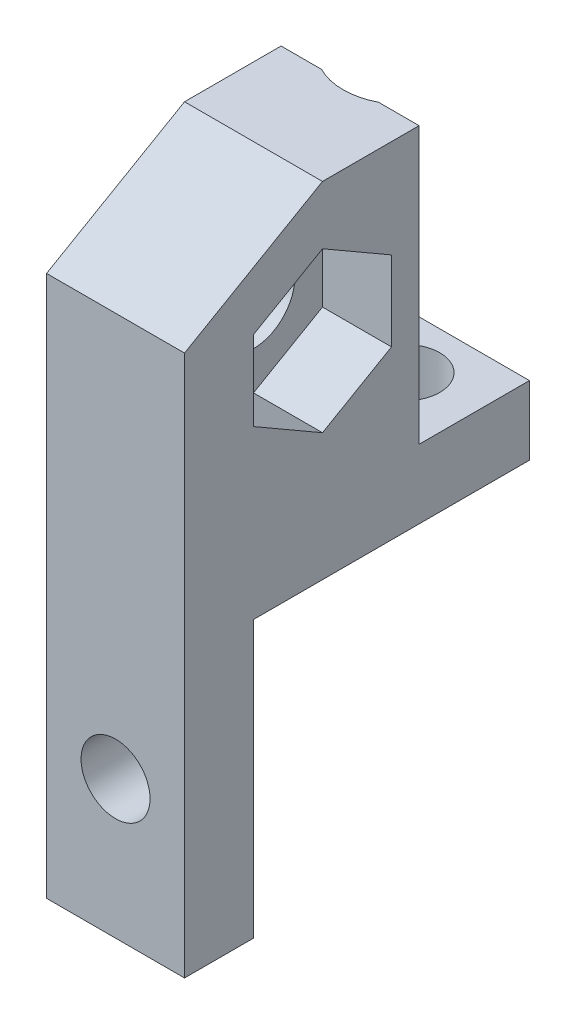
ISO-10303-21;
HEADER;
FILE_DESCRIPTION(('STEP AP214'),'2;1');
FILE_NAME('part.step','',(''),(''),'','','');
FILE_SCHEMA(('AUTOMOTIVE_DESIGN { 1 0 10303 214 1 1 1 1 }'));
ENDSEC;
DATA;
#1=APPLICATION_CONTEXT('core data for automotive mechanical design processes');
#2=APPLICATION_PROTOCOL_DEFINITION('international standard','automotive_design',2000,#1);
#3=PRODUCT_CONTEXT('',#1,'mechanical');
#4=PRODUCT('Part','Part','',(#3));
#5=PRODUCT_RELATED_PRODUCT_CATEGORY('part','',(#4));
#6=PRODUCT_DEFINITION_FORMATION('','',#4);
#7=PRODUCT_DEFINITION_CONTEXT('part definition',#1,'design');
#8=PRODUCT_DEFINITION('design','',#6,#7);
#9=PRODUCT_DEFINITION_SHAPE('','',#8);
#10=(LENGTH_UNIT() NAMED_UNIT(*) SI_UNIT(.MILLI.,.METRE.));
#11=(NAMED_UNIT(*) PLANE_ANGLE_UNIT() SI_UNIT($,.RADIAN.));
#12=(NAMED_UNIT(*) SI_UNIT($,.STERADIAN.) SOLID_ANGLE_UNIT());
#13=UNCERTAINTY_MEASURE_WITH_UNIT(LENGTH_MEASURE(1.E-05),#10,'distance_accuracy_value','');
#14=(GEOMETRIC_REPRESENTATION_CONTEXT(3) GLOBAL_UNCERTAINTY_ASSIGNED_CONTEXT((#13)) GLOBAL_UNIT_ASSIGNED_CONTEXT((#10,
#11,#12)) REPRESENTATION_CONTEXT('',''));
#15=CARTESIAN_POINT('',(0.,0.,0.));
#16=DIRECTION('',(0.,0.,1.));
#17=DIRECTION('',(1.,0.,0.));
#18=AXIS2_PLACEMENT_3D('',#15,#16,#17);
#19=CARTESIAN_POINT('',(0.,25.,-12.));
#20=DIRECTION('',(0.,0.,1.));
#21=DIRECTION('',(0.,-1.,0.));
#22=AXIS2_PLACEMENT_3D('',#19,#20,#21);
#23=PLANE('',#22);
#24=DIRECTION('',(0.,-1.,0.));
#25=VECTOR('',#24,1.);
#26=CARTESIAN_POINT('',(2.93844718719118,25.,-12.));
#27=LINE('',#26,#25);
#28=CARTESIAN_POINT('',(2.93844718719117,5.,-12.));
#29=VERTEX_POINT('',#28);
#30=CARTESIAN_POINT('',(2.93844718719118,25.,-12.));
#31=VERTEX_POINT('',#30);
#32=EDGE_CURVE('E193',#29,#31,#27,.F.);
#33=ORIENTED_EDGE('',*,*,#32,.F.);
#34=DIRECTION('',(1.,0.,0.));
#35=VECTOR('',#34,1.);
#36=CARTESIAN_POINT('',(0.,5.,-12.));
#37=LINE('',#36,#35);
#38=CARTESIAN_POINT('',(0.,5.,-12.));
#39=VERTEX_POINT('',#38);
#40=EDGE_CURVE('E212',#39,#29,#37,.T.);
#41=ORIENTED_EDGE('',*,*,#40,.F.);
#42=DIRECTION('',(0.,-1.,0.));
#43=VECTOR('',#42,1.);
#44=CARTESIAN_POINT('',(0.,25.,-12.));
#45=LINE('',#44,#43);
#46=CARTESIAN_POINT('',(0.,25.,-12.));
#47=VERTEX_POINT('',#46);
#48=EDGE_CURVE('E355',#47,#39,#45,.T.);
#49=ORIENTED_EDGE('',*,*,#48,.F.);
#50=DIRECTION('',(1.,0.,0.));
#51=VECTOR('',#50,1.);
#52=CARTESIAN_POINT('',(0.,25.,-12.));
#53=LINE('',#52,#51);
#54=EDGE_CURVE('E208',#47,#31,#53,.T.);
#55=ORIENTED_EDGE('',*,*,#54,.T.);
#56=EDGE_LOOP('',(#33,#41,#49,#55));
#57=FACE_BOUND('',#56,.T.);
#58=ADVANCED_FACE('F71',(#57),#23,.F.);
#59=DIRECTION('',(0.,-1.,0.));
#60=VECTOR('',#59,1.);
#61=CARTESIAN_POINT('',(7.06155281280882,25.,-12.));
#62=LINE('',#61,#60);
#63=CARTESIAN_POINT('',(7.06155281280882,25.,-12.));
#64=VERTEX_POINT('',#63);
#65=CARTESIAN_POINT('',(7.06155281280883,5.,-12.));
#66=VERTEX_POINT('',#65);
#67=EDGE_CURVE('E191',#64,#66,#62,.T.);
#68=ORIENTED_EDGE('',*,*,#67,.F.);
#69=CARTESIAN_POINT('',(10.,25.,-12.));
#70=VERTEX_POINT('',#69);
#71=EDGE_CURVE('E201',#64,#70,#53,.T.);
#72=ORIENTED_EDGE('',*,*,#71,.T.);
#73=DIRECTION('',(0.,-1.,0.));
#74=VECTOR('',#73,1.);
#75=CARTESIAN_POINT('',(10.,25.,-12.));
#76=LINE('',#75,#74);
#77=CARTESIAN_POINT('',(10.,5.,-12.));
#78=VERTEX_POINT('',#77);
#79=EDGE_CURVE('E356',#70,#78,#76,.T.);
#80=ORIENTED_EDGE('',*,*,#79,.T.);
#81=EDGE_CURVE('E91',#66,#78,#37,.T.);
#82=ORIENTED_EDGE('',*,*,#81,.F.);
#83=EDGE_LOOP('',(#68,#72,#80,#82));
#84=FACE_BOUND('',#83,.T.);
#85=ADVANCED_FACE('F200',(#84),#23,.F.);
#86=CARTESIAN_POINT('',(5.,0.,0.));
#87=DIRECTION('',(1.,0.,0.));
#88=DIRECTION('',(0.,0.,-1.));
#89=AXIS2_PLACEMENT_3D('',#86,#87,#88);
#90=PLANE('',#89);
#91=CARTESIAN_POINT('',(5.,15.,-5.));
#92=DIRECTION('',(1.,0.,0.));
#93=DIRECTION('',(0.,0.,-1.));
#94=AXIS2_PLACEMENT_3D('',#91,#92,#93);
#95=CIRCLE('',#94,3.);
#96=CARTESIAN_POINT('',(5.,15.,-8.));
#97=VERTEX_POINT('',#96);
#98=EDGE_CURVE('E286',#97,#97,#95,.T.);
#99=ORIENTED_EDGE('',*,*,#98,.F.);
#100=EDGE_LOOP('',(#99));
#101=FACE_BOUND('',#100,.T.);
#102=DIRECTION('',(0.,-1.,0.));
#103=VECTOR('',#102,1.);
#104=CARTESIAN_POINT('',(5.,0.,-10.));
#105=LINE('',#104,#103);
#106=CARTESIAN_POINT('',(5.,17.8867513459481,-10.));
#107=VERTEX_POINT('',#106);
#108=CARTESIAN_POINT('',(5.,12.1132486540519,-10.));
#109=VERTEX_POINT('',#108);
#110=EDGE_CURVE('E245',#107,#109,#105,.T.);
#111=ORIENTED_EDGE('',*,*,#110,.F.);
#112=DIRECTION('',(0.,-0.5,-0.866025403784439));
#113=VECTOR('',#112,1.);
#114=CARTESIAN_POINT('',(5.,17.7451905283833,-10.2451905283833));
#115=LINE('',#114,#113);
#116=CARTESIAN_POINT('',(5.,20.7735026918963,-5.00000000000001));
#117=VERTEX_POINT('',#116);
#118=EDGE_CURVE('E242',#117,#107,#115,.T.);
#119=ORIENTED_EDGE('',*,*,#118,.F.);
#120=DIRECTION('',(0.,0.5,-0.866025403784439));
#121=VECTOR('',#120,1.);
#122=CARTESIAN_POINT('',(5.,13.4150635094611,7.74519052838329));
#123=LINE('',#122,#121);
#124=CARTESIAN_POINT('',(5.,17.8867513459481,0.));
#125=VERTEX_POINT('',#124);
#126=EDGE_CURVE('E226',#125,#117,#123,.T.);
#127=ORIENTED_EDGE('',*,*,#126,.F.);
#128=DIRECTION('',(0.,1.,0.));
#129=VECTOR('',#128,1.);
#130=CARTESIAN_POINT('',(5.,0.,0.));
#131=LINE('',#130,#129);
#132=CARTESIAN_POINT('',(5.,12.1132486540519,0.));
#133=VERTEX_POINT('',#132);
#134=EDGE_CURVE('E254',#133,#125,#131,.T.);
#135=ORIENTED_EDGE('',*,*,#134,.F.);
#136=DIRECTION('',(0.,0.5,0.866025403784439));
#137=VECTOR('',#136,1.);
#138=CARTESIAN_POINT('',(5.,9.0849364905389,-5.24519052838329));
#139=LINE('',#138,#137);
#140=CARTESIAN_POINT('',(5.,9.22649730810374,-5.));
#141=VERTEX_POINT('',#140);
#142=EDGE_CURVE('E251',#141,#133,#139,.T.);
#143=ORIENTED_EDGE('',*,*,#142,.F.);
#144=DIRECTION('',(0.,-0.5,0.866025403784438));
#145=VECTOR('',#144,1.);
#146=CARTESIAN_POINT('',(5.,4.7548094716167,2.74519052838329));
#147=LINE('',#146,#145);
#148=EDGE_CURVE('E248',#109,#141,#147,.T.);
#149=ORIENTED_EDGE('',*,*,#148,.F.);
#150=EDGE_LOOP('',(#111,#119,#127,#135,#143,#149));
#151=FACE_BOUND('',#150,.T.);
#152=ADVANCED_FACE('F387',(#101,#151),#90,.T.);
#153=CARTESIAN_POINT('',(5.,0.,0.));
#154=DIRECTION('',(0.,-1.,0.));
#155=DIRECTION('',(0.,0.,-1.));
#156=AXIS2_PLACEMENT_3D('',#153,#154,#155);
#157=PLANE('',#156);
#158=CARTESIAN_POINT('',(5.,0.,-16.));
#159=DIRECTION('',(0.,-1.,0.));
#160=DIRECTION('',(0.,0.,-1.));
#161=AXIS2_PLACEMENT_3D('',#158,#159,#160);
#162=CIRCLE('',#161,2.5);
#163=CARTESIAN_POINT('',(5.,0.,-18.5));
#164=VERTEX_POINT('',#163);
#165=EDGE_CURVE('E363',#164,#164,#162,.T.);
#166=ORIENTED_EDGE('',*,*,#165,.F.);
#167=EDGE_LOOP('',(#166));
#168=FACE_BOUND('',#167,.T.);
#169=DIRECTION('',(0.,0.,1.));
#170=VECTOR('',#169,1.);
#171=CARTESIAN_POINT('',(0.,0.,0.));
#172=LINE('',#171,#170);
#173=CARTESIAN_POINT('',(0.,0.,-20.));
#174=VERTEX_POINT('',#173);
#175=CARTESIAN_POINT('',(0.,0.,0.));
#176=VERTEX_POINT('',#175);
#177=EDGE_CURVE('E285',#174,#176,#172,.T.);
#178=ORIENTED_EDGE('',*,*,#177,.F.);
#179=DIRECTION('',(-1.,0.,0.));
#180=VECTOR('',#179,1.);
#181=CARTESIAN_POINT('',(5.,0.,-20.));
#182=LINE('',#181,#180);
#183=CARTESIAN_POINT('',(10.,0.,-20.));
#184=VERTEX_POINT('',#183);
#185=EDGE_CURVE('E314',#184,#174,#182,.T.);
#186=ORIENTED_EDGE('',*,*,#185,.F.);
#187=DIRECTION('',(0.,0.,-1.));
#188=VECTOR('',#187,1.);
#189=CARTESIAN_POINT('',(10.,0.,0.));
#190=LINE('',#189,#188);
#191=CARTESIAN_POINT('',(10.,0.,0.));
#192=VERTEX_POINT('',#191);
#193=EDGE_CURVE('E273',#192,#184,#190,.T.);
#194=ORIENTED_EDGE('',*,*,#193,.F.);
#195=DIRECTION('',(-1.,0.,0.));
#196=VECTOR('',#195,1.);
#197=CARTESIAN_POINT('',(5.,0.,0.));
#198=LINE('',#197,#196);
#199=EDGE_CURVE('E289',#192,#176,#198,.T.);
#200=ORIENTED_EDGE('',*,*,#199,.T.);
#201=EDGE_LOOP('',(#178,#186,#194,#200));
#202=FACE_BOUND('',#201,.T.);
#203=ADVANCED_FACE('F347',(#168,#202),#157,.T.);
#204=CARTESIAN_POINT('',(5.,0.,-20.));
#205=DIRECTION('',(0.,0.,-1.));
#206=DIRECTION('',(0.,1.,0.));
#207=AXIS2_PLACEMENT_3D('',#204,#205,#206);
#208=PLANE('',#207);
#209=DIRECTION('',(1.,0.,0.));
#210=VECTOR('',#209,1.);
#211=CARTESIAN_POINT('',(0.,5.,-20.));
#212=LINE('',#211,#210);
#213=CARTESIAN_POINT('',(0.,5.,-20.));
#214=VERTEX_POINT('',#213);
#215=CARTESIAN_POINT('',(10.,5.,-20.));
#216=VERTEX_POINT('',#215);
#217=EDGE_CURVE('E209',#214,#216,#212,.T.);
#218=ORIENTED_EDGE('',*,*,#217,.T.);
#219=DIRECTION('',(0.,1.,0.));
#220=VECTOR('',#219,1.);
#221=CARTESIAN_POINT('',(10.,0.,-20.));
#222=LINE('',#221,#220);
#223=EDGE_CURVE('E276',#184,#216,#222,.T.);
#224=ORIENTED_EDGE('',*,*,#223,.F.);
#225=ORIENTED_EDGE('',*,*,#185,.T.);
#226=DIRECTION('',(0.,-1.,0.));
#227=VECTOR('',#226,1.);
#228=CARTESIAN_POINT('',(0.,0.,-20.));
#229=LINE('',#228,#227);
#230=EDGE_CURVE('E293',#214,#174,#229,.T.);
#231=ORIENTED_EDGE('',*,*,#230,.F.);
#232=EDGE_LOOP('',(#218,#224,#225,#231));
#233=FACE_BOUND('',#232,.T.);
#234=ADVANCED_FACE('F350',(#233),#208,.T.);
#235=CARTESIAN_POINT('',(5.,25.,0.));
#236=DIRECTION('',(0.,1.,0.));
#237=DIRECTION('',(0.,0.,1.));
#238=AXIS2_PLACEMENT_3D('',#235,#236,#237);
#239=PLANE('',#238);
#240=ORIENTED_EDGE('',*,*,#71,.F.);
#241=CARTESIAN_POINT('',(5.,25.,-16.));
#242=DIRECTION('',(0.,1.,0.));
#243=DIRECTION('',(0.,0.,1.));
#244=AXIS2_PLACEMENT_3D('',#241,#242,#243);
#245=CIRCLE('',#244,4.5);
#246=EDGE_CURVE('E188',#31,#64,#245,.T.);
#247=ORIENTED_EDGE('',*,*,#246,.F.);
#248=ORIENTED_EDGE('',*,*,#54,.F.);
#249=DIRECTION('',(0.,0.,-1.));
#250=VECTOR('',#249,1.);
#251=CARTESIAN_POINT('',(0.,25.,0.));
#252=LINE('',#251,#250);
#253=CARTESIAN_POINT('',(0.,25.,-5.00000000000007));
#254=VERTEX_POINT('',#253);
#255=EDGE_CURVE('E295',#254,#47,#252,.T.);
#256=ORIENTED_EDGE('',*,*,#255,.F.);
#257=DIRECTION('',(1.,0.,0.));
#258=VECTOR('',#257,1.);
#259=CARTESIAN_POINT('',(5.,25.,-5.00000000000007));
#260=LINE('',#259,#258);
#261=CARTESIAN_POINT('',(10.,25.,-5.00000000000007));
#262=VERTEX_POINT('',#261);
#263=EDGE_CURVE('E79',#254,#262,#260,.T.);
#264=ORIENTED_EDGE('',*,*,#263,.T.);
#265=DIRECTION('',(0.,0.,1.));
#266=VECTOR('',#265,1.);
#267=CARTESIAN_POINT('',(10.,25.,0.));
#268=LINE('',#267,#266);
#269=EDGE_CURVE('E207',#70,#262,#268,.T.);
#270=ORIENTED_EDGE('',*,*,#269,.F.);
#271=EDGE_LOOP('',(#240,#247,#248,#256,#264,#270));
#272=FACE_BOUND('',#271,.T.);
#273=ADVANCED_FACE('F205',(#272),#239,.T.);
#274=CARTESIAN_POINT('',(5.,0.,5.));
#275=DIRECTION('',(0.,0.,1.));
#276=DIRECTION('',(1.,0.,0.));
#277=AXIS2_PLACEMENT_3D('',#274,#275,#276);
#278=PLANE('',#277);
#279=CARTESIAN_POINT('',(5.,-10.,5.));
#280=DIRECTION('',(0.,0.,1.));
#281=DIRECTION('',(1.,0.,0.));
#282=AXIS2_PLACEMENT_3D('',#279,#280,#281);
#283=CIRCLE('',#282,2.5);
#284=CARTESIAN_POINT('',(7.50000000000001,-10.,5.));
#285=VERTEX_POINT('',#284);
#286=EDGE_CURVE('E211',#285,#285,#283,.T.);
#287=ORIENTED_EDGE('',*,*,#286,.F.);
#288=EDGE_LOOP('',(#287));
#289=FACE_BOUND('',#288,.T.);
#290=DIRECTION('',(0.,-1.,0.));
#291=VECTOR('',#290,1.);
#292=CARTESIAN_POINT('',(10.,0.,5.));
#293=LINE('',#292,#291);
#294=CARTESIAN_POINT('',(10.,19.2264973081037,5.));
#295=VERTEX_POINT('',#294);
#296=CARTESIAN_POINT('',(10.,-20.,5.));
#297=VERTEX_POINT('',#296);
#298=EDGE_CURVE('E280',#295,#297,#293,.T.);
#299=ORIENTED_EDGE('',*,*,#298,.F.);
#300=DIRECTION('',(-1.,0.,0.));
#301=VECTOR('',#300,1.);
#302=CARTESIAN_POINT('',(5.,19.2264973081037,5.));
#303=LINE('',#302,#301);
#304=CARTESIAN_POINT('',(0.,19.2264973081037,5.));
#305=VERTEX_POINT('',#304);
#306=EDGE_CURVE('E317',#295,#305,#303,.T.);
#307=ORIENTED_EDGE('',*,*,#306,.T.);
#308=DIRECTION('',(0.,1.,0.));
#309=VECTOR('',#308,1.);
#310=CARTESIAN_POINT('',(0.,0.,5.));
#311=LINE('',#310,#309);
#312=CARTESIAN_POINT('',(0.,-20.,5.));
#313=VERTEX_POINT('',#312);
#314=EDGE_CURVE('E298',#313,#305,#311,.T.);
#315=ORIENTED_EDGE('',*,*,#314,.F.);
#316=DIRECTION('',(-1.,0.,0.));
#317=VECTOR('',#316,1.);
#318=CARTESIAN_POINT('',(5.,-20.,5.));
#319=LINE('',#318,#317);
#320=EDGE_CURVE('E312',#297,#313,#319,.T.);
#321=ORIENTED_EDGE('',*,*,#320,.F.);
#322=EDGE_LOOP('',(#299,#307,#315,#321));
#323=FACE_BOUND('',#322,.T.);
#324=ADVANCED_FACE('F334',(#289,#323),#278,.T.);
#325=CARTESIAN_POINT('',(5.,-20.,0.));
#326=DIRECTION('',(0.,-1.,0.));
#327=DIRECTION('',(0.,0.,-1.));
#328=AXIS2_PLACEMENT_3D('',#325,#326,#327);
#329=PLANE('',#328);
#330=DIRECTION('',(0.,0.,1.));
#331=VECTOR('',#330,1.);
#332=CARTESIAN_POINT('',(0.,-20.,0.));
#333=LINE('',#332,#331);
#334=CARTESIAN_POINT('',(0.,-20.,0.));
#335=VERTEX_POINT('',#334);
#336=EDGE_CURVE('E301',#335,#313,#333,.T.);
#337=ORIENTED_EDGE('',*,*,#336,.F.);
#338=DIRECTION('',(-1.,0.,0.));
#339=VECTOR('',#338,1.);
#340=CARTESIAN_POINT('',(5.,-20.,0.));
#341=LINE('',#340,#339);
#342=CARTESIAN_POINT('',(10.,-20.,0.));
#343=VERTEX_POINT('',#342);
#344=EDGE_CURVE('E310',#343,#335,#341,.T.);
#345=ORIENTED_EDGE('',*,*,#344,.F.);
#346=DIRECTION('',(0.,0.,-1.));
#347=VECTOR('',#346,1.);
#348=CARTESIAN_POINT('',(10.,-20.,0.));
#349=LINE('',#348,#347);
#350=EDGE_CURVE('E282',#297,#343,#349,.T.);
#351=ORIENTED_EDGE('',*,*,#350,.F.);
#352=ORIENTED_EDGE('',*,*,#320,.T.);
#353=EDGE_LOOP('',(#337,#345,#351,#352));
#354=FACE_BOUND('',#353,.T.);
#355=ADVANCED_FACE('F339',(#354),#329,.T.);
#356=CARTESIAN_POINT('',(5.,0.,0.));
#357=DIRECTION('',(0.,0.,-1.));
#358=DIRECTION('',(-1.,0.,0.));
#359=AXIS2_PLACEMENT_3D('',#356,#357,#358);
#360=PLANE('',#359);
#361=CARTESIAN_POINT('',(5.,-10.,0.));
#362=DIRECTION('',(0.,0.,-1.));
#363=DIRECTION('',(-1.,0.,0.));
#364=AXIS2_PLACEMENT_3D('',#361,#362,#363);
#365=CIRCLE('',#364,2.5);
#366=CARTESIAN_POINT('',(7.50000000000001,-10.,0.));
#367=VERTEX_POINT('',#366);
#368=EDGE_CURVE('E221',#367,#367,#365,.T.);
#369=ORIENTED_EDGE('',*,*,#368,.F.);
#370=EDGE_LOOP('',(#369));
#371=FACE_BOUND('',#370,.T.);
#372=DIRECTION('',(0.,-1.,0.));
#373=VECTOR('',#372,1.);
#374=CARTESIAN_POINT('',(0.,0.,0.));
#375=LINE('',#374,#373);
#376=EDGE_CURVE('E304',#176,#335,#375,.T.);
#377=ORIENTED_EDGE('',*,*,#376,.F.);
#378=ORIENTED_EDGE('',*,*,#199,.F.);
#379=DIRECTION('',(0.,1.,0.));
#380=VECTOR('',#379,1.);
#381=CARTESIAN_POINT('',(10.,0.,0.));
#382=LINE('',#381,#380);
#383=EDGE_CURVE('E261',#343,#192,#382,.T.);
#384=ORIENTED_EDGE('',*,*,#383,.F.);
#385=ORIENTED_EDGE('',*,*,#344,.T.);
#386=EDGE_LOOP('',(#377,#378,#384,#385));
#387=FACE_BOUND('',#386,.T.);
#388=ADVANCED_FACE('F343',(#371,#387),#360,.T.);
#389=CARTESIAN_POINT('',(5.,15.,-5.));
#390=DIRECTION('',(-1.,0.,0.));
#391=DIRECTION('',(0.,0.,1.));
#392=AXIS2_PLACEMENT_3D('',#389,#390,#391);
#393=CYLINDRICAL_SURFACE('',#392,3.);
#394=ORIENTED_EDGE('',*,*,#98,.T.);
#395=EDGE_LOOP('',(#394));
#396=FACE_BOUND('',#395,.T.);
#397=CARTESIAN_POINT('',(0.,15.,-5.));
#398=DIRECTION('',(1.,0.,0.));
#399=DIRECTION('',(0.,0.,-1.));
#400=AXIS2_PLACEMENT_3D('',#397,#398,#399);
#401=CIRCLE('',#400,3.);
#402=CARTESIAN_POINT('',(0.,15.,-8.));
#403=VERTEX_POINT('',#402);
#404=EDGE_CURVE('E290',#403,#403,#401,.T.);
#405=ORIENTED_EDGE('',*,*,#404,.F.);
#406=EDGE_LOOP('',(#405));
#407=FACE_BOUND('',#406,.T.);
#408=ADVANCED_FACE('F425',(#396,#407),#393,.F.);
#409=CARTESIAN_POINT('',(0.,0.,0.));
#410=DIRECTION('',(1.,0.,0.));
#411=DIRECTION('',(0.,0.,-1.));
#412=AXIS2_PLACEMENT_3D('',#409,#410,#411);
#413=PLANE('',#412);
#414=ORIENTED_EDGE('',*,*,#255,.T.);
#415=ORIENTED_EDGE('',*,*,#48,.T.);
#416=DIRECTION('',(0.,0.,-1.));
#417=VECTOR('',#416,1.);
#418=CARTESIAN_POINT('',(0.,5.,-12.));
#419=LINE('',#418,#417);
#420=EDGE_CURVE('E358',#39,#214,#419,.T.);
#421=ORIENTED_EDGE('',*,*,#420,.T.);
#422=ORIENTED_EDGE('',*,*,#230,.T.);
#423=ORIENTED_EDGE('',*,*,#177,.T.);
#424=ORIENTED_EDGE('',*,*,#376,.T.);
#425=ORIENTED_EDGE('',*,*,#336,.T.);
#426=ORIENTED_EDGE('',*,*,#314,.T.);
#427=DIRECTION('',(0.,-0.499999999999998,0.86602540378444));
#428=VECTOR('',#427,1.);
#429=CARTESIAN_POINT('',(0.,19.2264973081037,5.));
#430=LINE('',#429,#428);
#431=EDGE_CURVE('E322',#305,#254,#430,.F.);
#432=ORIENTED_EDGE('',*,*,#431,.T.);
#433=EDGE_LOOP('',(#414,#415,#421,#422,#423,#424,#425,#426,#432));
#434=FACE_BOUND('',#433,.T.);
#435=ORIENTED_EDGE('',*,*,#404,.T.);
#436=EDGE_LOOP('',(#435));
#437=FACE_BOUND('',#436,.T.);
#438=ADVANCED_FACE('F418',(#434,#437),#413,.F.);
#439=CARTESIAN_POINT('',(10.,0.,0.));
#440=DIRECTION('',(-1.,0.,0.));
#441=DIRECTION('',(0.,0.,1.));
#442=AXIS2_PLACEMENT_3D('',#439,#440,#441);
#443=PLANE('',#442);
#444=DIRECTION('',(0.,0.5,-0.866025403784439));
#445=VECTOR('',#444,1.);
#446=CARTESIAN_POINT('',(10.,13.4150635094611,7.74519052838329));
#447=LINE('',#446,#445);
#448=CARTESIAN_POINT('',(10.,17.8867513459481,0.));
#449=VERTEX_POINT('',#448);
#450=CARTESIAN_POINT('',(10.,20.7735026918963,-5.00000000000001));
#451=VERTEX_POINT('',#450);
#452=EDGE_CURVE('E238',#449,#451,#447,.T.);
#453=ORIENTED_EDGE('',*,*,#452,.T.);
#454=DIRECTION('',(0.,-0.5,-0.866025403784439));
#455=VECTOR('',#454,1.);
#456=CARTESIAN_POINT('',(10.,17.7451905283833,-10.2451905283833));
#457=LINE('',#456,#455);
#458=CARTESIAN_POINT('',(10.,17.8867513459481,-10.));
#459=VERTEX_POINT('',#458);
#460=EDGE_CURVE('E222',#451,#459,#457,.T.);
#461=ORIENTED_EDGE('',*,*,#460,.T.);
#462=DIRECTION('',(0.,-1.,0.));
#463=VECTOR('',#462,1.);
#464=CARTESIAN_POINT('',(10.,0.,-10.));
#465=LINE('',#464,#463);
#466=CARTESIAN_POINT('',(10.,12.1132486540519,-10.));
#467=VERTEX_POINT('',#466);
#468=EDGE_CURVE('E225',#459,#467,#465,.T.);
#469=ORIENTED_EDGE('',*,*,#468,.T.);
#470=DIRECTION('',(0.,-0.5,0.866025403784438));
#471=VECTOR('',#470,1.);
#472=CARTESIAN_POINT('',(10.,4.7548094716167,2.74519052838329));
#473=LINE('',#472,#471);
#474=CARTESIAN_POINT('',(10.,9.22649730810374,-5.));
#475=VERTEX_POINT('',#474);
#476=EDGE_CURVE('E229',#467,#475,#473,.T.);
#477=ORIENTED_EDGE('',*,*,#476,.T.);
#478=DIRECTION('',(0.,0.5,0.866025403784439));
#479=VECTOR('',#478,1.);
#480=CARTESIAN_POINT('',(10.,9.0849364905389,-5.24519052838329));
#481=LINE('',#480,#479);
#482=CARTESIAN_POINT('',(10.,12.1132486540519,0.));
#483=VERTEX_POINT('',#482);
#484=EDGE_CURVE('E232',#475,#483,#481,.T.);
#485=ORIENTED_EDGE('',*,*,#484,.T.);
#486=DIRECTION('',(0.,1.,0.));
#487=VECTOR('',#486,1.);
#488=CARTESIAN_POINT('',(10.,0.,0.));
#489=LINE('',#488,#487);
#490=EDGE_CURVE('E235',#483,#449,#489,.T.);
#491=ORIENTED_EDGE('',*,*,#490,.T.);
#492=EDGE_LOOP('',(#453,#461,#469,#477,#485,#491));
#493=FACE_BOUND('',#492,.T.);
#494=DIRECTION('',(0.,0.,-1.));
#495=VECTOR('',#494,1.);
#496=CARTESIAN_POINT('',(10.,5.,-12.));
#497=LINE('',#496,#495);
#498=EDGE_CURVE('E215',#78,#216,#497,.T.);
#499=ORIENTED_EDGE('',*,*,#498,.F.);
#500=ORIENTED_EDGE('',*,*,#79,.F.);
#501=ORIENTED_EDGE('',*,*,#269,.T.);
#502=DIRECTION('',(0.,0.499999999999998,-0.86602540378444));
#503=VECTOR('',#502,1.);
#504=CARTESIAN_POINT('',(10.,19.2264973081037,5.));
#505=LINE('',#504,#503);
#506=EDGE_CURVE('E12',#262,#295,#505,.F.);
#507=ORIENTED_EDGE('',*,*,#506,.T.);
#508=ORIENTED_EDGE('',*,*,#298,.T.);
#509=ORIENTED_EDGE('',*,*,#350,.T.);
#510=ORIENTED_EDGE('',*,*,#383,.T.);
#511=ORIENTED_EDGE('',*,*,#193,.T.);
#512=ORIENTED_EDGE('',*,*,#223,.T.);
#513=EDGE_LOOP('',(#499,#500,#501,#507,#508,#509,#510,#511,#512));
#514=FACE_BOUND('',#513,.T.);
#515=ADVANCED_FACE('F331',(#493,#514),#443,.F.);
#516=CARTESIAN_POINT('',(10.,17.7451905283833,-10.2451905283833));
#517=DIRECTION('',(0.,0.866025403784439,-0.5));
#518=DIRECTION('',(0.,0.5,0.866025403784439));
#519=AXIS2_PLACEMENT_3D('',#516,#517,#518);
#520=PLANE('',#519);
#521=ORIENTED_EDGE('',*,*,#118,.T.);
#522=DIRECTION('',(-1.,0.,0.));
#523=VECTOR('',#522,1.);
#524=CARTESIAN_POINT('',(10.,17.8867513459481,-10.));
#525=LINE('',#524,#523);
#526=EDGE_CURVE('E241',#459,#107,#525,.T.);
#527=ORIENTED_EDGE('',*,*,#526,.F.);
#528=ORIENTED_EDGE('',*,*,#460,.F.);
#529=DIRECTION('',(-1.,0.,0.));
#530=VECTOR('',#529,1.);
#531=CARTESIAN_POINT('',(10.,20.7735026918963,-5.00000000000001));
#532=LINE('',#531,#530);
#533=EDGE_CURVE('E259',#451,#117,#532,.T.);
#534=ORIENTED_EDGE('',*,*,#533,.T.);
#535=EDGE_LOOP('',(#521,#527,#528,#534));
#536=FACE_BOUND('',#535,.T.);
#537=ADVANCED_FACE('F397',(#536),#520,.F.);
#538=CARTESIAN_POINT('',(10.,13.4150635094611,7.74519052838329));
#539=DIRECTION('',(0.,0.866025403784438,0.5));
#540=DIRECTION('',(0.,-0.5,0.866025403784439));
#541=AXIS2_PLACEMENT_3D('',#538,#539,#540);
#542=PLANE('',#541);
#543=ORIENTED_EDGE('',*,*,#126,.T.);
#544=ORIENTED_EDGE('',*,*,#533,.F.);
#545=ORIENTED_EDGE('',*,*,#452,.F.);
#546=DIRECTION('',(-1.,0.,0.));
#547=VECTOR('',#546,1.);
#548=CARTESIAN_POINT('',(10.,17.8867513459481,0.));
#549=LINE('',#548,#547);
#550=EDGE_CURVE('E262',#449,#125,#549,.T.);
#551=ORIENTED_EDGE('',*,*,#550,.T.);
#552=EDGE_LOOP('',(#543,#544,#545,#551));
#553=FACE_BOUND('',#552,.T.);
#554=ADVANCED_FACE('F393',(#553),#542,.F.);
#555=CARTESIAN_POINT('',(10.,0.,0.));
#556=DIRECTION('',(0.,0.,1.));
#557=DIRECTION('',(0.,-1.,0.));
#558=AXIS2_PLACEMENT_3D('',#555,#556,#557);
#559=PLANE('',#558);
#560=ORIENTED_EDGE('',*,*,#134,.T.);
#561=ORIENTED_EDGE('',*,*,#550,.F.);
#562=ORIENTED_EDGE('',*,*,#490,.F.);
#563=DIRECTION('',(-1.,0.,0.));
#564=VECTOR('',#563,1.);
#565=CARTESIAN_POINT('',(10.,12.1132486540519,0.));
#566=LINE('',#565,#564);
#567=EDGE_CURVE('E264',#483,#133,#566,.T.);
#568=ORIENTED_EDGE('',*,*,#567,.T.);
#569=EDGE_LOOP('',(#560,#561,#562,#568));
#570=FACE_BOUND('',#569,.T.);
#571=ADVANCED_FACE('F396',(#570),#559,.F.);
#572=CARTESIAN_POINT('',(10.,9.0849364905389,-5.24519052838329));
#573=DIRECTION('',(0.,-0.866025403784439,0.5));
#574=DIRECTION('',(0.,-0.5,-0.866025403784439));
#575=AXIS2_PLACEMENT_3D('',#572,#573,#574);
#576=PLANE('',#575);
#577=ORIENTED_EDGE('',*,*,#142,.T.);
#578=ORIENTED_EDGE('',*,*,#567,.F.);
#579=ORIENTED_EDGE('',*,*,#484,.F.);
#580=DIRECTION('',(-1.,0.,0.));
#581=VECTOR('',#580,1.);
#582=CARTESIAN_POINT('',(10.,9.22649730810374,-5.));
#583=LINE('',#582,#581);
#584=EDGE_CURVE('E266',#475,#141,#583,.T.);
#585=ORIENTED_EDGE('',*,*,#584,.T.);
#586=EDGE_LOOP('',(#577,#578,#579,#585));
#587=FACE_BOUND('',#586,.T.);
#588=ADVANCED_FACE('F401',(#587),#576,.F.);
#589=CARTESIAN_POINT('',(10.,4.7548094716167,2.74519052838329));
#590=DIRECTION('',(0.,-0.866025403784438,-0.5));
#591=DIRECTION('',(0.,0.5,-0.866025403784438));
#592=AXIS2_PLACEMENT_3D('',#589,#590,#591);
#593=PLANE('',#592);
#594=ORIENTED_EDGE('',*,*,#148,.T.);
#595=ORIENTED_EDGE('',*,*,#584,.F.);
#596=ORIENTED_EDGE('',*,*,#476,.F.);
#597=DIRECTION('',(-1.,0.,0.));
#598=VECTOR('',#597,1.);
#599=CARTESIAN_POINT('',(10.,12.1132486540519,-10.));
#600=LINE('',#599,#598);
#601=EDGE_CURVE('E268',#467,#109,#600,.T.);
#602=ORIENTED_EDGE('',*,*,#601,.T.);
#603=EDGE_LOOP('',(#594,#595,#596,#602));
#604=FACE_BOUND('',#603,.T.);
#605=ADVANCED_FACE('F405',(#604),#593,.F.);
#606=CARTESIAN_POINT('',(10.,0.,-10.));
#607=DIRECTION('',(0.,0.,-1.));
#608=DIRECTION('',(-1.,0.,0.));
#609=AXIS2_PLACEMENT_3D('',#606,#607,#608);
#610=PLANE('',#609);
#611=ORIENTED_EDGE('',*,*,#110,.T.);
#612=ORIENTED_EDGE('',*,*,#601,.F.);
#613=ORIENTED_EDGE('',*,*,#468,.F.);
#614=ORIENTED_EDGE('',*,*,#526,.T.);
#615=EDGE_LOOP('',(#611,#612,#613,#614));
#616=FACE_BOUND('',#615,.T.);
#617=ADVANCED_FACE('F391',(#616),#610,.F.);
#618=CARTESIAN_POINT('',(5.,-10.,-20.));
#619=DIRECTION('',(0.,0.,1.));
#620=DIRECTION('',(1.,0.,0.));
#621=AXIS2_PLACEMENT_3D('',#618,#619,#620);
#622=CYLINDRICAL_SURFACE('',#621,2.5);
#623=CARTESIAN_POINT('',(7.50000000000001,-10.,0.));
#624=CARTESIAN_POINT('',(7.50000000000001,-10.,0.0520833333333334));
#625=CARTESIAN_POINT('',(7.50000000000001,-10.,0.104166666666667));
#626=CARTESIAN_POINT('',(7.50000000000001,-10.,0.208333333333334));
#627=CARTESIAN_POINT('',(7.50000000000001,-10.,0.260416666666667));
#628=CARTESIAN_POINT('',(7.50000000000001,-10.,0.364583333333334));
#629=CARTESIAN_POINT('',(7.50000000000001,-10.,0.416666666666667));
#630=CARTESIAN_POINT('',(7.50000000000001,-10.,0.520833333333334));
#631=CARTESIAN_POINT('',(7.50000000000001,-10.,0.572916666666667));
#632=CARTESIAN_POINT('',(7.50000000000001,-10.,0.677083333333334));
#633=CARTESIAN_POINT('',(7.50000000000001,-10.,0.729166666666667));
#634=CARTESIAN_POINT('',(7.50000000000001,-10.,0.833333333333334));
#635=CARTESIAN_POINT('',(7.50000000000001,-10.,0.885416666666668));
#636=CARTESIAN_POINT('',(7.50000000000001,-10.,0.989583333333334));
#637=CARTESIAN_POINT('',(7.50000000000001,-10.,1.04166666666667));
#638=CARTESIAN_POINT('',(7.50000000000001,-10.,1.14583333333333));
#639=CARTESIAN_POINT('',(7.50000000000001,-10.,1.19791666666667));
#640=CARTESIAN_POINT('',(7.50000000000001,-10.,1.30208333333333));
#641=CARTESIAN_POINT('',(7.50000000000001,-10.,1.35416666666667));
#642=CARTESIAN_POINT('',(7.50000000000001,-10.,1.45833333333333));
#643=CARTESIAN_POINT('',(7.50000000000001,-10.,1.51041666666666));
#644=CARTESIAN_POINT('',(7.50000000000001,-10.,1.61458333333333));
#645=CARTESIAN_POINT('',(7.50000000000001,-10.,1.66666666666666));
#646=CARTESIAN_POINT('',(7.50000000000001,-10.,1.77083333333333));
#647=CARTESIAN_POINT('',(7.50000000000001,-10.,1.82291666666666));
#648=CARTESIAN_POINT('',(7.50000000000001,-10.,1.92708333333333));
#649=CARTESIAN_POINT('',(7.50000000000001,-10.,1.97916666666667));
#650=CARTESIAN_POINT('',(7.50000000000001,-10.,2.08333333333333));
#651=CARTESIAN_POINT('',(7.50000000000001,-10.,2.13541666666667));
#652=CARTESIAN_POINT('',(7.50000000000001,-10.,2.23958333333333));
#653=CARTESIAN_POINT('',(7.50000000000001,-10.,2.29166666666667));
#654=CARTESIAN_POINT('',(7.50000000000001,-10.,2.39583333333333));
#655=CARTESIAN_POINT('',(7.50000000000001,-10.,2.44791666666667));
#656=CARTESIAN_POINT('',(7.50000000000001,-10.,2.55208333333333));
#657=CARTESIAN_POINT('',(7.50000000000001,-10.,2.60416666666667));
#658=CARTESIAN_POINT('',(7.50000000000001,-10.,2.70833333333333));
#659=CARTESIAN_POINT('',(7.50000000000001,-10.,2.76041666666667));
#660=CARTESIAN_POINT('',(7.50000000000001,-10.,2.86458333333333));
#661=CARTESIAN_POINT('',(7.50000000000001,-10.,2.91666666666667));
#662=CARTESIAN_POINT('',(7.50000000000001,-10.,3.02083333333333));
#663=CARTESIAN_POINT('',(7.50000000000001,-10.,3.07291666666667));
#664=CARTESIAN_POINT('',(7.50000000000001,-10.,3.17708333333333));
#665=CARTESIAN_POINT('',(7.50000000000001,-10.,3.22916666666667));
#666=CARTESIAN_POINT('',(7.50000000000001,-10.,3.33333333333333));
#667=CARTESIAN_POINT('',(7.50000000000001,-10.,3.38541666666667));
#668=CARTESIAN_POINT('',(7.50000000000001,-10.,3.48958333333333));
#669=CARTESIAN_POINT('',(7.50000000000001,-10.,3.54166666666667));
#670=CARTESIAN_POINT('',(7.50000000000001,-10.,3.64583333333333));
#671=CARTESIAN_POINT('',(7.50000000000001,-10.,3.69791666666666));
#672=CARTESIAN_POINT('',(7.50000000000001,-10.,3.80208333333333));
#673=CARTESIAN_POINT('',(7.50000000000001,-10.,3.85416666666667));
#674=CARTESIAN_POINT('',(7.50000000000001,-10.,3.95833333333333));
#675=CARTESIAN_POINT('',(7.50000000000001,-10.,4.01041666666666));
#676=CARTESIAN_POINT('',(7.50000000000001,-10.,4.11458333333333));
#677=CARTESIAN_POINT('',(7.50000000000001,-10.,4.16666666666666));
#678=CARTESIAN_POINT('',(7.50000000000001,-10.,4.27083333333333));
#679=CARTESIAN_POINT('',(7.50000000000001,-10.,4.32291666666666));
#680=CARTESIAN_POINT('',(7.50000000000001,-10.,4.42708333333333));
#681=CARTESIAN_POINT('',(7.50000000000001,-10.,4.47916666666666));
#682=CARTESIAN_POINT('',(7.50000000000001,-10.,4.58333333333333));
#683=CARTESIAN_POINT('',(7.50000000000001,-10.,4.63541666666666));
#684=CARTESIAN_POINT('',(7.50000000000001,-10.,4.73958333333333));
#685=CARTESIAN_POINT('',(7.50000000000001,-10.,4.79166666666666));
#686=CARTESIAN_POINT('',(7.50000000000001,-10.,4.89583333333333));
#687=CARTESIAN_POINT('',(7.50000000000001,-10.,4.94791666666666));
#688=CARTESIAN_POINT('',(7.50000000000001,-10.,5.));
#689=B_SPLINE_CURVE_WITH_KNOTS('',3,(#623,#624,#625,#626,#627,#628,#629,#630,#631,#632,#633,
#634,#635,#636,#637,#638,#639,#640,#641,#642,#643,#644,#645,#646,#647,#648,#649,#650,#651,#652,
#653,#654,#655,#656,#657,#658,#659,#660,#661,#662,#663,#664,#665,#666,#667,#668,#669,#670,#671,
#672,#673,#674,#675,#676,#677,#678,#679,#680,#681,#682,#683,#684,#685,#686,#687,#688),
.UNSPECIFIED.,.F.,.F.,(4,2,2,2,2,2,2,2,2,2,2,2,2,2,2,2,2,2,2,2,2,2,2,2,2,2,2,2,2,2,2,2,4),(0.,
0.15625,0.3125,0.46875,0.625000000000001,0.781250000000001,0.937500000000001,1.09375,1.25,
1.40625,1.5625,1.71875,1.875,2.03125,2.1875,2.34375,2.5,2.65625,2.8125,2.96875,3.125,3.28125,
3.4375,3.59375,3.75,3.90625,4.0625,4.21875,4.375,4.53125,4.6875,4.84375,5.),.UNSPECIFIED.);
#690=EDGE_CURVE('BSEAM380',#367,#285,#689,.T.);
#691=ORIENTED_EDGE('',*,*,#368,.T.);
#692=ORIENTED_EDGE('',*,*,#286,.T.);
#693=ORIENTED_EDGE('',*,*,#690,.T.);
#694=ORIENTED_EDGE('',*,*,#690,.F.);
#695=EDGE_LOOP('',(#691,#693,#692,#694));
#696=FACE_BOUND('',#695,.T.);
#697=ADVANCED_FACE('F380',(#696),#622,.F.);
#698=CARTESIAN_POINT('',(5.,19.2264973081037,5.));
#699=DIRECTION('',(0.,-0.86602540378444,-0.499999999999998));
#700=DIRECTION('',(-1.,0.,0.));
#701=AXIS2_PLACEMENT_3D('',#698,#699,#700);
#702=PLANE('',#701);
#703=ORIENTED_EDGE('',*,*,#506,.F.);
#704=ORIENTED_EDGE('',*,*,#263,.F.);
#705=ORIENTED_EDGE('',*,*,#431,.F.);
#706=ORIENTED_EDGE('',*,*,#306,.F.);
#707=EDGE_LOOP('',(#703,#704,#705,#706));
#708=FACE_BOUND('',#707,.T.);
#709=ADVANCED_FACE('F73',(#708),#702,.F.);
#710=CARTESIAN_POINT('',(0.,5.,-12.));
#711=DIRECTION('',(0.,-1.,0.));
#712=DIRECTION('',(0.,0.,-1.));
#713=AXIS2_PLACEMENT_3D('',#710,#711,#712);
#714=PLANE('',#713);
#715=CARTESIAN_POINT('',(5.,5.,-16.));
#716=DIRECTION('',(0.,1.,0.));
#717=DIRECTION('',(0.,0.,1.));
#718=AXIS2_PLACEMENT_3D('',#715,#716,#717);
#719=CIRCLE('',#718,2.5);
#720=CARTESIAN_POINT('',(5.,5.,-13.5));
#721=VERTEX_POINT('',#720);
#722=EDGE_CURVE('E367',#721,#721,#719,.T.);
#723=ORIENTED_EDGE('',*,*,#722,.F.);
#724=EDGE_LOOP('',(#723));
#725=FACE_BOUND('',#724,.T.);
#726=ORIENTED_EDGE('',*,*,#498,.T.);
#727=ORIENTED_EDGE('',*,*,#217,.F.);
#728=ORIENTED_EDGE('',*,*,#420,.F.);
#729=ORIENTED_EDGE('',*,*,#40,.T.);
#730=CARTESIAN_POINT('',(5.,5.,-16.));
#731=DIRECTION('',(0.,1.,0.));
#732=DIRECTION('',(0.,0.,1.));
#733=AXIS2_PLACEMENT_3D('',#730,#731,#732);
#734=CIRCLE('',#733,4.5);
#735=EDGE_CURVE('E86',#29,#66,#734,.T.);
#736=ORIENTED_EDGE('',*,*,#735,.T.);
#737=ORIENTED_EDGE('',*,*,#81,.T.);
#738=EDGE_LOOP('',(#726,#727,#728,#729,#736,#737));
#739=FACE_BOUND('',#738,.T.);
#740=ADVANCED_FACE('F354',(#725,#739),#714,.F.);
#741=CARTESIAN_POINT('',(5.,25.,-16.));
#742=DIRECTION('',(0.,-1.,0.));
#743=DIRECTION('',(0.,0.,-1.));
#744=AXIS2_PLACEMENT_3D('',#741,#742,#743);
#745=CYLINDRICAL_SURFACE('',#744,4.5);
#746=ORIENTED_EDGE('',*,*,#32,.T.);
#747=ORIENTED_EDGE('',*,*,#246,.T.);
#748=ORIENTED_EDGE('',*,*,#67,.T.);
#749=ORIENTED_EDGE('',*,*,#735,.F.);
#750=EDGE_LOOP('',(#746,#747,#748,#749));
#751=FACE_BOUND('',#750,.T.);
#752=ADVANCED_FACE('F190',(#751),#745,.F.);
#753=CARTESIAN_POINT('',(5.,-20.,-16.));
#754=DIRECTION('',(0.,1.,0.));
#755=DIRECTION('',(0.,0.,1.));
#756=AXIS2_PLACEMENT_3D('',#753,#754,#755);
#757=CYLINDRICAL_SURFACE('',#756,2.5);
#758=ORIENTED_EDGE('',*,*,#165,.T.);
#759=EDGE_LOOP('',(#758));
#760=FACE_BOUND('',#759,.T.);
#761=ORIENTED_EDGE('',*,*,#722,.T.);
#762=EDGE_LOOP('',(#761));
#763=FACE_BOUND('',#762,.T.);
#764=ADVANCED_FACE('F371',(#760,#763),#757,.F.);
#765=CLOSED_SHELL('',(#58,#85,#152,#203,#234,#273,#324,#355,#388,#408,#438,#515,#537,#554,#571,
#588,#605,#617,#697,#709,#740,#752,#764));
#766=MANIFOLD_SOLID_BREP('B2',#765);
#767=ADVANCED_BREP_SHAPE_REPRESENTATION('',(#18,#766),#14);
#768=SHAPE_DEFINITION_REPRESENTATION(#9,#767);
ENDSEC;
END-ISO-10303-21;
